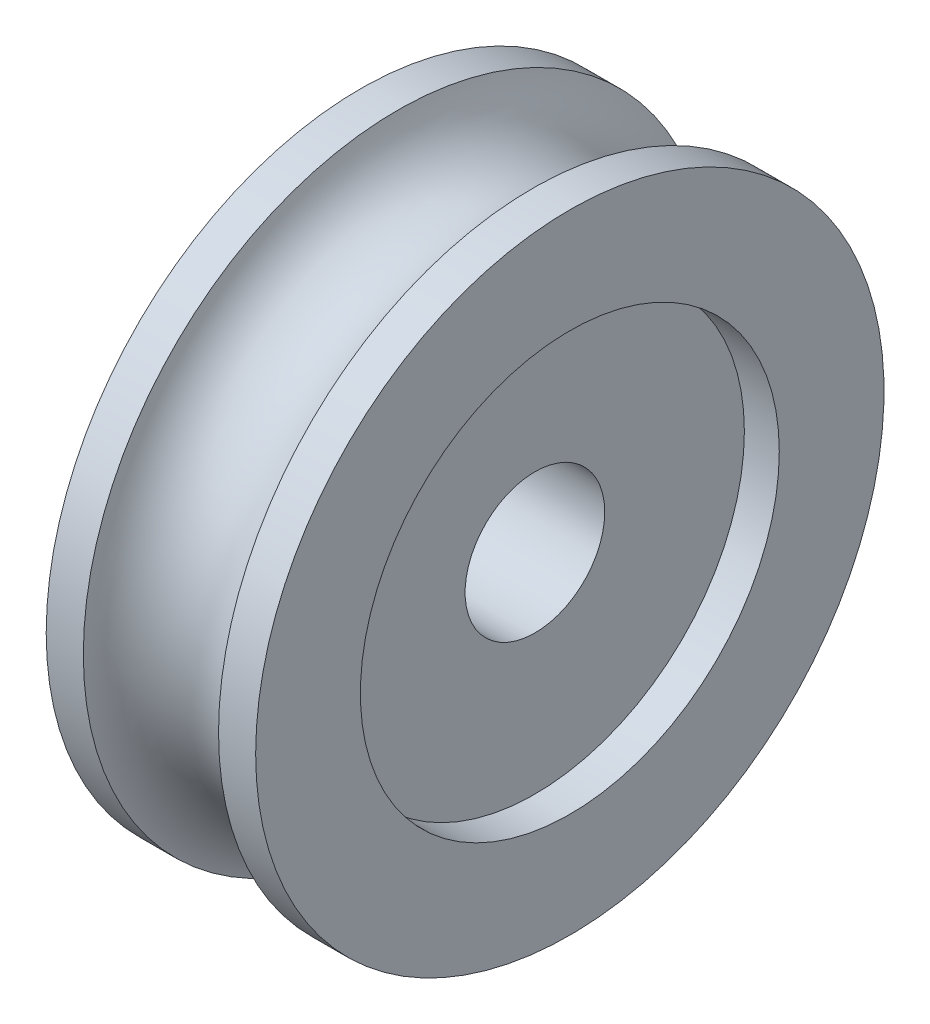
ISO-10303-21;
HEADER;
FILE_DESCRIPTION(('STEP AP214'),'2;1');
FILE_NAME('part.step','',(''),(''),'','','');
FILE_SCHEMA(('AUTOMOTIVE_DESIGN { 1 0 10303 214 1 1 1 1 }'));
ENDSEC;
DATA;
#1=APPLICATION_CONTEXT('core data for automotive mechanical design processes');
#2=APPLICATION_PROTOCOL_DEFINITION('international standard','automotive_design',2000,#1);
#3=PRODUCT_CONTEXT('',#1,'mechanical');
#4=PRODUCT('Part','Part','',(#3));
#5=PRODUCT_RELATED_PRODUCT_CATEGORY('part','',(#4));
#6=PRODUCT_DEFINITION_FORMATION('','',#4);
#7=PRODUCT_DEFINITION_CONTEXT('part definition',#1,'design');
#8=PRODUCT_DEFINITION('design','',#6,#7);
#9=PRODUCT_DEFINITION_SHAPE('','',#8);
#10=(LENGTH_UNIT() NAMED_UNIT(*) SI_UNIT(.MILLI.,.METRE.));
#11=(NAMED_UNIT(*) PLANE_ANGLE_UNIT() SI_UNIT($,.RADIAN.));
#12=(NAMED_UNIT(*) SI_UNIT($,.STERADIAN.) SOLID_ANGLE_UNIT());
#13=UNCERTAINTY_MEASURE_WITH_UNIT(LENGTH_MEASURE(1.E-05),#10,'distance_accuracy_value','');
#14=(GEOMETRIC_REPRESENTATION_CONTEXT(3) GLOBAL_UNCERTAINTY_ASSIGNED_CONTEXT((#13)) GLOBAL_UNIT_ASSIGNED_CONTEXT((#10,
#11,#12)) REPRESENTATION_CONTEXT('',''));
#15=CARTESIAN_POINT('',(0.,0.,0.));
#16=DIRECTION('',(0.,0.,1.));
#17=DIRECTION('',(1.,0.,0.));
#18=AXIS2_PLACEMENT_3D('',#15,#16,#17);
#19=CARTESIAN_POINT('',(-52.,0.,4.5));
#20=DIRECTION('',(1.,0.,0.));
#21=DIRECTION('',(0.,0.,-1.));
#22=AXIS2_PLACEMENT_3D('',#19,#20,#21);
#23=CYLINDRICAL_SURFACE('',#22,2.);
#24=CARTESIAN_POINT('',(2.,0.,4.5));
#25=DIRECTION('',(1.,0.,0.));
#26=DIRECTION('',(0.,0.,-1.));
#27=AXIS2_PLACEMENT_3D('',#24,#25,#26);
#28=CIRCLE('',#27,2.);
#29=CARTESIAN_POINT('',(2.,0.,2.5));
#30=VERTEX_POINT('',#29);
#31=EDGE_CURVE('E47',#30,#30,#28,.F.);
#32=ORIENTED_EDGE('',*,*,#31,.F.);
#33=EDGE_LOOP('',(#32));
#34=FACE_BOUND('',#33,.T.);
#35=CARTESIAN_POINT('',(-2.,0.,4.5));
#36=DIRECTION('',(-1.,0.,0.));
#37=DIRECTION('',(0.,0.,1.));
#38=AXIS2_PLACEMENT_3D('',#35,#36,#37);
#39=CIRCLE('',#38,2.);
#40=CARTESIAN_POINT('',(-2.,0.,6.5));
#41=VERTEX_POINT('',#40);
#42=EDGE_CURVE('E35',#41,#41,#39,.F.);
#43=ORIENTED_EDGE('',*,*,#42,.F.);
#44=EDGE_LOOP('',(#43));
#45=FACE_BOUND('',#44,.T.);
#46=ADVANCED_FACE('F31',(#34,#45),#23,.F.);
#47=CARTESIAN_POINT('',(3.,0.,-4.5));
#48=DIRECTION('',(-1.,0.,0.));
#49=DIRECTION('',(0.,0.,1.));
#50=AXIS2_PLACEMENT_3D('',#47,#48,#49);
#51=PLANE('',#50);
#52=CARTESIAN_POINT('',(3.,0.,4.5));
#53=DIRECTION('',(1.,0.,0.));
#54=DIRECTION('',(0.,0.,-1.));
#55=AXIS2_PLACEMENT_3D('',#52,#53,#54);
#56=CIRCLE('',#55,6.);
#57=CARTESIAN_POINT('',(3.,0.,-1.5));
#58=VERTEX_POINT('',#57);
#59=EDGE_CURVE('E56',#58,#58,#56,.T.);
#60=ORIENTED_EDGE('',*,*,#59,.F.);
#61=EDGE_LOOP('',(#60));
#62=FACE_BOUND('',#61,.T.);
#63=CARTESIAN_POINT('',(3.,0.,4.5));
#64=DIRECTION('',(-1.,0.,0.));
#65=DIRECTION('',(0.,0.,1.));
#66=AXIS2_PLACEMENT_3D('',#63,#64,#65);
#67=CIRCLE('',#66,9.);
#68=CARTESIAN_POINT('',(3.,0.,13.5));
#69=VERTEX_POINT('',#68);
#70=EDGE_CURVE('E10',#69,#69,#67,.T.);
#71=ORIENTED_EDGE('',*,*,#70,.F.);
#72=EDGE_LOOP('',(#71));
#73=FACE_BOUND('',#72,.T.);
#74=ADVANCED_FACE('F33',(#62,#73),#51,.F.);
#75=CARTESIAN_POINT('',(-3.,0.,4.5));
#76=DIRECTION('',(-1.,0.,0.));
#77=DIRECTION('',(0.,0.,1.));
#78=AXIS2_PLACEMENT_3D('',#75,#76,#77);
#79=CYLINDRICAL_SURFACE('',#78,9.);
#80=CARTESIAN_POINT('',(1.93649167310371,0.,4.5));
#81=DIRECTION('',(-1.,0.,0.));
#82=DIRECTION('',(0.,0.,1.));
#83=AXIS2_PLACEMENT_3D('',#80,#81,#82);
#84=CIRCLE('',#83,9.);
#85=CARTESIAN_POINT('',(1.93649167310371,0.,13.5));
#86=VERTEX_POINT('',#85);
#87=EDGE_CURVE('E39',#86,#86,#84,.T.);
#88=ORIENTED_EDGE('',*,*,#87,.F.);
#89=EDGE_LOOP('',(#88));
#90=FACE_BOUND('',#89,.T.);
#91=ORIENTED_EDGE('',*,*,#70,.T.);
#92=EDGE_LOOP('',(#91));
#93=FACE_BOUND('',#92,.T.);
#94=ADVANCED_FACE('F73',(#90,#93),#79,.T.);
#95=CARTESIAN_POINT('',(0.,0.,4.5));
#96=DIRECTION('',(-1.,0.,0.));
#97=DIRECTION('',(0.,0.,1.));
#98=AXIS2_PLACEMENT_3D('',#95,#96,#97);
#99=TOROIDAL_SURFACE('',#98,9.5,2.);
#100=CARTESIAN_POINT('',(-1.93649167310371,0.,4.5));
#101=DIRECTION('',(-1.,0.,0.));
#102=DIRECTION('',(0.,0.,1.));
#103=AXIS2_PLACEMENT_3D('',#100,#101,#102);
#104=CIRCLE('',#103,9.);
#105=CARTESIAN_POINT('',(-1.9364916731037,0.,13.5));
#106=VERTEX_POINT('',#105);
#107=EDGE_CURVE('E44',#106,#106,#104,.T.);
#108=ORIENTED_EDGE('',*,*,#107,.F.);
#109=EDGE_LOOP('',(#108));
#110=FACE_BOUND('',#109,.T.);
#111=ORIENTED_EDGE('',*,*,#87,.T.);
#112=EDGE_LOOP('',(#111));
#113=FACE_BOUND('',#112,.T.);
#114=ADVANCED_FACE('F70',(#110,#113),#99,.F.);
#115=CARTESIAN_POINT('',(-3.,0.,4.5));
#116=DIRECTION('',(-1.,0.,0.));
#117=DIRECTION('',(0.,0.,1.));
#118=AXIS2_PLACEMENT_3D('',#115,#116,#117);
#119=CYLINDRICAL_SURFACE('',#118,9.);
#120=CARTESIAN_POINT('',(-3.,0.,4.5));
#121=DIRECTION('',(-1.,0.,0.));
#122=DIRECTION('',(0.,0.,1.));
#123=AXIS2_PLACEMENT_3D('',#120,#121,#122);
#124=CIRCLE('',#123,9.);
#125=CARTESIAN_POINT('',(-3.,0.,13.5));
#126=VERTEX_POINT('',#125);
#127=EDGE_CURVE('E49',#126,#126,#124,.T.);
#128=ORIENTED_EDGE('',*,*,#127,.F.);
#129=EDGE_LOOP('',(#128));
#130=FACE_BOUND('',#129,.T.);
#131=ORIENTED_EDGE('',*,*,#107,.T.);
#132=EDGE_LOOP('',(#131));
#133=FACE_BOUND('',#132,.T.);
#134=ADVANCED_FACE('F68',(#130,#133),#119,.T.);
#135=CARTESIAN_POINT('',(-3.,0.,-4.5));
#136=DIRECTION('',(1.,0.,0.));
#137=DIRECTION('',(0.,0.,-1.));
#138=AXIS2_PLACEMENT_3D('',#135,#136,#137);
#139=PLANE('',#138);
#140=CARTESIAN_POINT('',(-3.,0.,4.5));
#141=DIRECTION('',(-1.,0.,0.));
#142=DIRECTION('',(0.,0.,1.));
#143=AXIS2_PLACEMENT_3D('',#140,#141,#142);
#144=CIRCLE('',#143,6.);
#145=CARTESIAN_POINT('',(-3.,0.,10.5));
#146=VERTEX_POINT('',#145);
#147=EDGE_CURVE('E63',#146,#146,#144,.T.);
#148=ORIENTED_EDGE('',*,*,#147,.F.);
#149=EDGE_LOOP('',(#148));
#150=FACE_BOUND('',#149,.T.);
#151=ORIENTED_EDGE('',*,*,#127,.T.);
#152=EDGE_LOOP('',(#151));
#153=FACE_BOUND('',#152,.T.);
#154=ADVANCED_FACE('F92',(#150,#153),#139,.F.);
#155=CARTESIAN_POINT('',(2.,0.,4.5));
#156=DIRECTION('',(1.,0.,0.));
#157=DIRECTION('',(0.,0.,-1.));
#158=AXIS2_PLACEMENT_3D('',#155,#156,#157);
#159=PLANE('',#158);
#160=CARTESIAN_POINT('',(2.,0.,4.5));
#161=DIRECTION('',(1.,0.,0.));
#162=DIRECTION('',(0.,0.,-1.));
#163=AXIS2_PLACEMENT_3D('',#160,#161,#162);
#164=CIRCLE('',#163,6.);
#165=CARTESIAN_POINT('',(2.,0.,-1.5));
#166=VERTEX_POINT('',#165);
#167=EDGE_CURVE('E50',#166,#166,#164,.T.);
#168=ORIENTED_EDGE('',*,*,#167,.T.);
#169=EDGE_LOOP('',(#168));
#170=FACE_BOUND('',#169,.T.);
#171=ORIENTED_EDGE('',*,*,#31,.T.);
#172=EDGE_LOOP('',(#171));
#173=FACE_BOUND('',#172,.T.);
#174=ADVANCED_FACE('F95',(#170,#173),#159,.T.);
#175=CARTESIAN_POINT('',(2.,0.,4.5));
#176=DIRECTION('',(1.,0.,0.));
#177=DIRECTION('',(0.,0.,-1.));
#178=AXIS2_PLACEMENT_3D('',#175,#176,#177);
#179=CYLINDRICAL_SURFACE('',#178,6.);
#180=ORIENTED_EDGE('',*,*,#167,.F.);
#181=EDGE_LOOP('',(#180));
#182=FACE_BOUND('',#181,.T.);
#183=ORIENTED_EDGE('',*,*,#59,.T.);
#184=EDGE_LOOP('',(#183));
#185=FACE_BOUND('',#184,.T.);
#186=ADVANCED_FACE('F90',(#182,#185),#179,.F.);
#187=CARTESIAN_POINT('',(-2.,0.,4.5));
#188=DIRECTION('',(-1.,0.,0.));
#189=DIRECTION('',(0.,0.,1.));
#190=AXIS2_PLACEMENT_3D('',#187,#188,#189);
#191=PLANE('',#190);
#192=CARTESIAN_POINT('',(-2.,0.,4.5));
#193=DIRECTION('',(-1.,0.,0.));
#194=DIRECTION('',(0.,0.,1.));
#195=AXIS2_PLACEMENT_3D('',#192,#193,#194);
#196=CIRCLE('',#195,6.);
#197=CARTESIAN_POINT('',(-2.,0.,10.5));
#198=VERTEX_POINT('',#197);
#199=EDGE_CURVE('E171',#198,#198,#196,.T.);
#200=ORIENTED_EDGE('',*,*,#199,.T.);
#201=EDGE_LOOP('',(#200));
#202=FACE_BOUND('',#201,.T.);
#203=ORIENTED_EDGE('',*,*,#42,.T.);
#204=EDGE_LOOP('',(#203));
#205=FACE_BOUND('',#204,.T.);
#206=ADVANCED_FACE('F122',(#202,#205),#191,.T.);
#207=CARTESIAN_POINT('',(-2.,0.,4.5));
#208=DIRECTION('',(-1.,0.,0.));
#209=DIRECTION('',(0.,0.,1.));
#210=AXIS2_PLACEMENT_3D('',#207,#208,#209);
#211=CYLINDRICAL_SURFACE('',#210,6.);
#212=ORIENTED_EDGE('',*,*,#199,.F.);
#213=EDGE_LOOP('',(#212));
#214=FACE_BOUND('',#213,.T.);
#215=ORIENTED_EDGE('',*,*,#147,.T.);
#216=EDGE_LOOP('',(#215));
#217=FACE_BOUND('',#216,.T.);
#218=ADVANCED_FACE('F128',(#214,#217),#211,.F.);
#219=CLOSED_SHELL('',(#46,#74,#94,#114,#134,#154,#174,#186,#206,#218));
#220=MANIFOLD_SOLID_BREP('B2',#219);
#221=ADVANCED_BREP_SHAPE_REPRESENTATION('',(#18,#220),#14);
#222=SHAPE_DEFINITION_REPRESENTATION(#9,#221);
ENDSEC;
END-ISO-10303-21;
